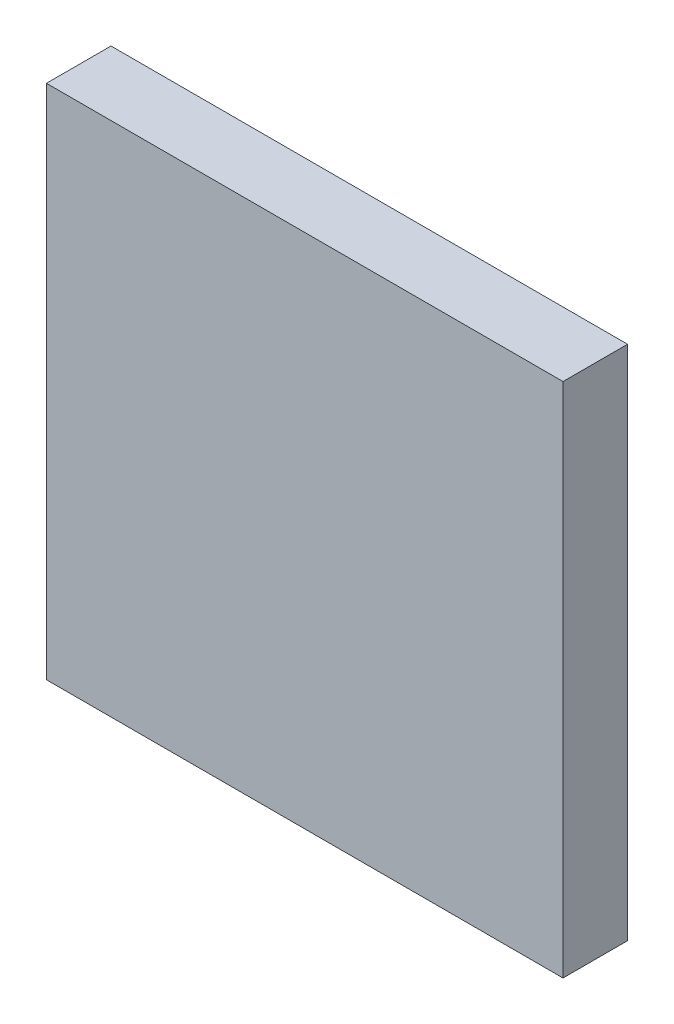
ISO-10303-21;
HEADER;
FILE_DESCRIPTION(('STEP AP214'),'2;1');
FILE_NAME('part.step','',(''),(''),'','','');
FILE_SCHEMA(('AUTOMOTIVE_DESIGN { 1 0 10303 214 1 1 1 1 }'));
ENDSEC;
DATA;
#1=APPLICATION_CONTEXT('core data for automotive mechanical design processes');
#2=APPLICATION_PROTOCOL_DEFINITION('international standard','automotive_design',2000,#1);
#3=PRODUCT_CONTEXT('',#1,'mechanical');
#4=PRODUCT('Part','Part','',(#3));
#5=PRODUCT_RELATED_PRODUCT_CATEGORY('part','',(#4));
#6=PRODUCT_DEFINITION_FORMATION('','',#4);
#7=PRODUCT_DEFINITION_CONTEXT('part definition',#1,'design');
#8=PRODUCT_DEFINITION('design','',#6,#7);
#9=PRODUCT_DEFINITION_SHAPE('','',#8);
#10=(LENGTH_UNIT() NAMED_UNIT(*) SI_UNIT(.MILLI.,.METRE.));
#11=(NAMED_UNIT(*) PLANE_ANGLE_UNIT() SI_UNIT($,.RADIAN.));
#12=(NAMED_UNIT(*) SI_UNIT($,.STERADIAN.) SOLID_ANGLE_UNIT());
#13=UNCERTAINTY_MEASURE_WITH_UNIT(LENGTH_MEASURE(1.E-05),#10,'distance_accuracy_value','');
#14=(GEOMETRIC_REPRESENTATION_CONTEXT(3) GLOBAL_UNCERTAINTY_ASSIGNED_CONTEXT((#13)) GLOBAL_UNIT_ASSIGNED_CONTEXT((#10,
#11,#12)) REPRESENTATION_CONTEXT('',''));
#15=CARTESIAN_POINT('',(0.,0.,0.));
#16=DIRECTION('',(0.,0.,1.));
#17=DIRECTION('',(1.,0.,0.));
#18=AXIS2_PLACEMENT_3D('',#15,#16,#17);
#19=CARTESIAN_POINT('',(-43.2836734693877,-26.6311224489796,3.175));
#20=DIRECTION('',(1.,0.,0.));
#21=DIRECTION('',(0.,0.,-1.));
#22=AXIS2_PLACEMENT_3D('',#19,#20,#21);
#23=PLANE('',#22);
#24=DIRECTION('',(0.,-1.,0.));
#25=VECTOR('',#24,1.);
#26=CARTESIAN_POINT('',(-43.2836734693877,-26.6311224489796,0.));
#27=LINE('',#26,#25);
#28=CARTESIAN_POINT('',(-43.2836734693877,-1.23112244897959,0.));
#29=VERTEX_POINT('',#28);
#30=CARTESIAN_POINT('',(-43.2836734693877,-26.6311224489796,0.));
#31=VERTEX_POINT('',#30);
#32=EDGE_CURVE('E98',#29,#31,#27,.T.);
#33=ORIENTED_EDGE('',*,*,#32,.T.);
#34=DIRECTION('',(0.,0.,-1.));
#35=VECTOR('',#34,1.);
#36=CARTESIAN_POINT('',(-43.2836734693877,-26.6311224489796,3.175));
#37=LINE('',#36,#35);
#38=CARTESIAN_POINT('',(-43.2836734693877,-26.6311224489796,3.175));
#39=VERTEX_POINT('',#38);
#40=EDGE_CURVE('E11',#39,#31,#37,.T.);
#41=ORIENTED_EDGE('',*,*,#40,.F.);
#42=DIRECTION('',(0.,-1.,0.));
#43=VECTOR('',#42,1.);
#44=CARTESIAN_POINT('',(-43.2836734693877,-26.6311224489796,3.175));
#45=LINE('',#44,#43);
#46=CARTESIAN_POINT('',(-43.2836734693877,-1.23112244897959,3.175));
#47=VERTEX_POINT('',#46);
#48=EDGE_CURVE('E86',#47,#39,#45,.T.);
#49=ORIENTED_EDGE('',*,*,#48,.F.);
#50=DIRECTION('',(0.,0.,-1.));
#51=VECTOR('',#50,1.);
#52=CARTESIAN_POINT('',(-43.2836734693877,-1.23112244897959,3.175));
#53=LINE('',#52,#51);
#54=EDGE_CURVE('E94',#47,#29,#53,.T.);
#55=ORIENTED_EDGE('',*,*,#54,.T.);
#56=EDGE_LOOP('',(#33,#41,#49,#55));
#57=FACE_BOUND('',#56,.T.);
#58=ADVANCED_FACE('F35',(#57),#23,.F.);
#59=CARTESIAN_POINT('',(-43.2836734693877,-26.6311224489796,3.175));
#60=DIRECTION('',(0.,1.,0.));
#61=DIRECTION('',(0.,0.,1.));
#62=AXIS2_PLACEMENT_3D('',#59,#60,#61);
#63=PLANE('',#62);
#64=DIRECTION('',(1.,0.,0.));
#65=VECTOR('',#64,1.);
#66=CARTESIAN_POINT('',(-43.2836734693877,-26.6311224489796,0.));
#67=LINE('',#66,#65);
#68=CARTESIAN_POINT('',(-17.8836734693877,-26.6311224489796,0.));
#69=VERTEX_POINT('',#68);
#70=EDGE_CURVE('E90',#31,#69,#67,.T.);
#71=ORIENTED_EDGE('',*,*,#70,.T.);
#72=DIRECTION('',(0.,0.,-1.));
#73=VECTOR('',#72,1.);
#74=CARTESIAN_POINT('',(-17.8836734693877,-26.6311224489796,3.175));
#75=LINE('',#74,#73);
#76=CARTESIAN_POINT('',(-17.8836734693877,-26.6311224489796,3.175));
#77=VERTEX_POINT('',#76);
#78=EDGE_CURVE('E43',#77,#69,#75,.T.);
#79=ORIENTED_EDGE('',*,*,#78,.F.);
#80=DIRECTION('',(1.,0.,0.));
#81=VECTOR('',#80,1.);
#82=CARTESIAN_POINT('',(-43.2836734693877,-26.6311224489796,3.175));
#83=LINE('',#82,#81);
#84=EDGE_CURVE('E81',#39,#77,#83,.T.);
#85=ORIENTED_EDGE('',*,*,#84,.F.);
#86=ORIENTED_EDGE('',*,*,#40,.T.);
#87=EDGE_LOOP('',(#71,#79,#85,#86));
#88=FACE_BOUND('',#87,.T.);
#89=ADVANCED_FACE('F89',(#88),#63,.F.);
#90=CARTESIAN_POINT('',(-17.8836734693877,-26.6311224489796,3.175));
#91=DIRECTION('',(-1.,0.,0.));
#92=DIRECTION('',(0.,0.,1.));
#93=AXIS2_PLACEMENT_3D('',#90,#91,#92);
#94=PLANE('',#93);
#95=DIRECTION('',(0.,1.,0.));
#96=VECTOR('',#95,1.);
#97=CARTESIAN_POINT('',(-17.8836734693877,-26.6311224489796,0.));
#98=LINE('',#97,#96);
#99=CARTESIAN_POINT('',(-17.8836734693877,-1.23112244897958,0.));
#100=VERTEX_POINT('',#99);
#101=EDGE_CURVE('E68',#69,#100,#98,.T.);
#102=ORIENTED_EDGE('',*,*,#101,.T.);
#103=DIRECTION('',(0.,0.,-1.));
#104=VECTOR('',#103,1.);
#105=CARTESIAN_POINT('',(-17.8836734693877,-1.23112244897958,3.175));
#106=LINE('',#105,#104);
#107=CARTESIAN_POINT('',(-17.8836734693877,-1.23112244897958,3.175));
#108=VERTEX_POINT('',#107);
#109=EDGE_CURVE('E91',#108,#100,#106,.T.);
#110=ORIENTED_EDGE('',*,*,#109,.F.);
#111=DIRECTION('',(0.,1.,0.));
#112=VECTOR('',#111,1.);
#113=CARTESIAN_POINT('',(-17.8836734693877,-26.6311224489796,3.175));
#114=LINE('',#113,#112);
#115=EDGE_CURVE('E84',#77,#108,#114,.T.);
#116=ORIENTED_EDGE('',*,*,#115,.F.);
#117=ORIENTED_EDGE('',*,*,#78,.T.);
#118=EDGE_LOOP('',(#102,#110,#116,#117));
#119=FACE_BOUND('',#118,.T.);
#120=ADVANCED_FACE('F92',(#119),#94,.F.);
#121=CARTESIAN_POINT('',(-43.2836734693877,-1.23112244897959,3.175));
#122=DIRECTION('',(0.,-1.,0.));
#123=DIRECTION('',(1.,0.,0.));
#124=AXIS2_PLACEMENT_3D('',#121,#122,#123);
#125=PLANE('',#124);
#126=DIRECTION('',(-1.,0.,0.));
#127=VECTOR('',#126,1.);
#128=CARTESIAN_POINT('',(-43.2836734693877,-1.23112244897959,0.));
#129=LINE('',#128,#127);
#130=EDGE_CURVE('E74',#100,#29,#129,.T.);
#131=ORIENTED_EDGE('',*,*,#130,.T.);
#132=ORIENTED_EDGE('',*,*,#54,.F.);
#133=DIRECTION('',(-1.,0.,0.));
#134=VECTOR('',#133,1.);
#135=CARTESIAN_POINT('',(-43.2836734693877,-1.23112244897959,3.175));
#136=LINE('',#135,#134);
#137=EDGE_CURVE('E51',#108,#47,#136,.T.);
#138=ORIENTED_EDGE('',*,*,#137,.F.);
#139=ORIENTED_EDGE('',*,*,#109,.T.);
#140=EDGE_LOOP('',(#131,#132,#138,#139));
#141=FACE_BOUND('',#140,.T.);
#142=ADVANCED_FACE('F105',(#141),#125,.F.);
#143=CARTESIAN_POINT('',(0.,0.,3.175));
#144=DIRECTION('',(0.,0.,-1.));
#145=DIRECTION('',(-1.,0.,0.));
#146=AXIS2_PLACEMENT_3D('',#143,#144,#145);
#147=PLANE('',#146);
#148=ORIENTED_EDGE('',*,*,#48,.T.);
#149=ORIENTED_EDGE('',*,*,#84,.T.);
#150=ORIENTED_EDGE('',*,*,#115,.T.);
#151=ORIENTED_EDGE('',*,*,#137,.T.);
#152=EDGE_LOOP('',(#148,#149,#150,#151));
#153=FACE_BOUND('',#152,.T.);
#154=ADVANCED_FACE('F82',(#153),#147,.F.);
#155=CARTESIAN_POINT('',(0.,0.,0.));
#156=DIRECTION('',(0.,0.,-1.));
#157=DIRECTION('',(-1.,0.,0.));
#158=AXIS2_PLACEMENT_3D('',#155,#156,#157);
#159=PLANE('',#158);
#160=ORIENTED_EDGE('',*,*,#32,.F.);
#161=ORIENTED_EDGE('',*,*,#130,.F.);
#162=ORIENTED_EDGE('',*,*,#101,.F.);
#163=ORIENTED_EDGE('',*,*,#70,.F.);
#164=EDGE_LOOP('',(#160,#161,#162,#163));
#165=FACE_BOUND('',#164,.T.);
#166=ADVANCED_FACE('F108',(#165),#159,.T.);
#167=CLOSED_SHELL('',(#58,#89,#120,#142,#154,#166));
#168=MANIFOLD_SOLID_BREP('B2',#167);
#169=ADVANCED_BREP_SHAPE_REPRESENTATION('',(#18,#168),#14);
#170=SHAPE_DEFINITION_REPRESENTATION(#9,#169);
ENDSEC;
END-ISO-10303-21;
